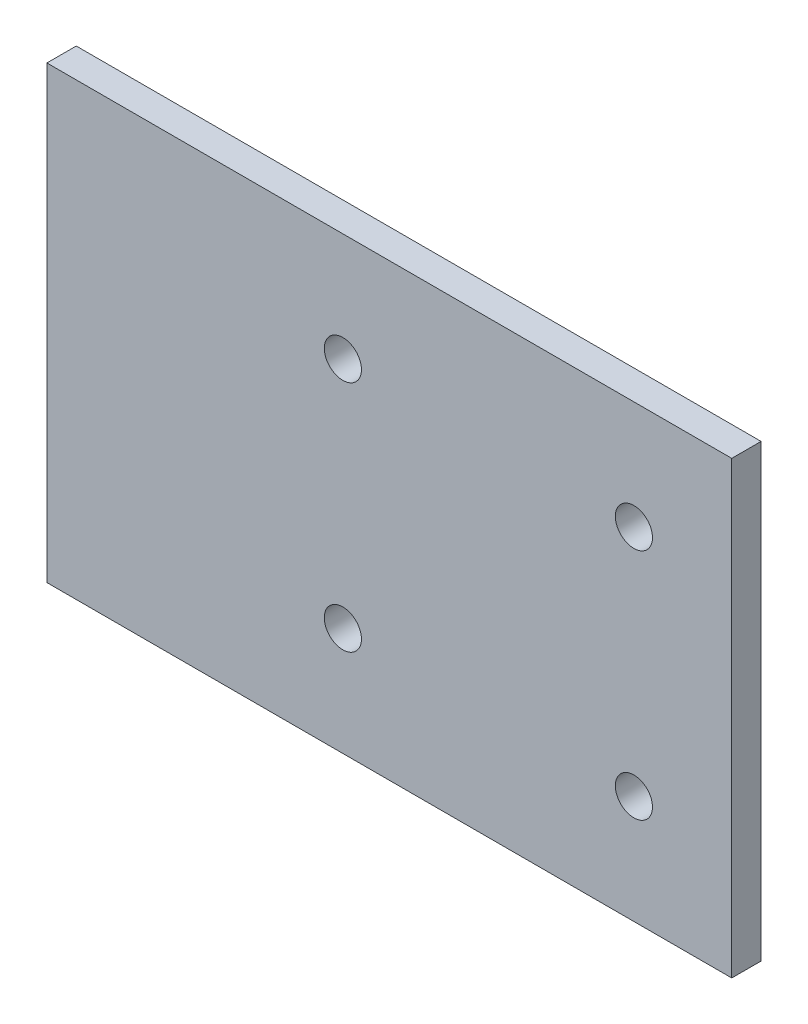
ISO-10303-21;
HEADER;
FILE_DESCRIPTION(('STEP AP214'),'2;1');
FILE_NAME('part.step','',(''),(''),'','','');
FILE_SCHEMA(('AUTOMOTIVE_DESIGN { 1 0 10303 214 1 1 1 1 }'));
ENDSEC;
DATA;
#1=APPLICATION_CONTEXT('core data for automotive mechanical design processes');
#2=APPLICATION_PROTOCOL_DEFINITION('international standard','automotive_design',2000,#1);
#3=PRODUCT_CONTEXT('',#1,'mechanical');
#4=PRODUCT('Part','Part','',(#3));
#5=PRODUCT_RELATED_PRODUCT_CATEGORY('part','',(#4));
#6=PRODUCT_DEFINITION_FORMATION('','',#4);
#7=PRODUCT_DEFINITION_CONTEXT('part definition',#1,'design');
#8=PRODUCT_DEFINITION('design','',#6,#7);
#9=PRODUCT_DEFINITION_SHAPE('','',#8);
#10=(LENGTH_UNIT() NAMED_UNIT(*) SI_UNIT(.MILLI.,.METRE.));
#11=(NAMED_UNIT(*) PLANE_ANGLE_UNIT() SI_UNIT($,.RADIAN.));
#12=(NAMED_UNIT(*) SI_UNIT($,.STERADIAN.) SOLID_ANGLE_UNIT());
#13=UNCERTAINTY_MEASURE_WITH_UNIT(LENGTH_MEASURE(1.E-05),#10,'distance_accuracy_value','');
#14=(GEOMETRIC_REPRESENTATION_CONTEXT(3) GLOBAL_UNCERTAINTY_ASSIGNED_CONTEXT((#13)) GLOBAL_UNIT_ASSIGNED_CONTEXT((#10,
#11,#12)) REPRESENTATION_CONTEXT('',''));
#15=CARTESIAN_POINT('',(0.,0.,0.));
#16=DIRECTION('',(0.,0.,1.));
#17=DIRECTION('',(1.,0.,0.));
#18=AXIS2_PLACEMENT_3D('',#15,#16,#17);
#19=CARTESIAN_POINT('',(-36.0143442622951,24.5901639344262,3.));
#20=DIRECTION('',(1.,0.,0.));
#21=DIRECTION('',(0.,0.,-1.));
#22=AXIS2_PLACEMENT_3D('',#19,#20,#21);
#23=PLANE('',#22);
#24=DIRECTION('',(0.,-1.,0.));
#25=VECTOR('',#24,1.);
#26=CARTESIAN_POINT('',(-36.0143442622951,24.5901639344262,0.));
#27=LINE('',#26,#25);
#28=CARTESIAN_POINT('',(-36.0143442622951,24.5901639344262,0.));
#29=VERTEX_POINT('',#28);
#30=CARTESIAN_POINT('',(-36.0143442622951,-21.4098360655738,0.));
#31=VERTEX_POINT('',#30);
#32=EDGE_CURVE('E98',#29,#31,#27,.T.);
#33=ORIENTED_EDGE('',*,*,#32,.T.);
#34=DIRECTION('',(0.,0.,-1.));
#35=VECTOR('',#34,1.);
#36=CARTESIAN_POINT('',(-36.0143442622951,-21.4098360655738,3.));
#37=LINE('',#36,#35);
#38=CARTESIAN_POINT('',(-36.0143442622951,-21.4098360655738,3.));
#39=VERTEX_POINT('',#38);
#40=EDGE_CURVE('E11',#39,#31,#37,.T.);
#41=ORIENTED_EDGE('',*,*,#40,.F.);
#42=DIRECTION('',(0.,-1.,0.));
#43=VECTOR('',#42,1.);
#44=CARTESIAN_POINT('',(-36.0143442622951,24.5901639344262,3.));
#45=LINE('',#44,#43);
#46=CARTESIAN_POINT('',(-36.0143442622951,24.5901639344262,3.));
#47=VERTEX_POINT('',#46);
#48=EDGE_CURVE('E86',#47,#39,#45,.T.);
#49=ORIENTED_EDGE('',*,*,#48,.F.);
#50=DIRECTION('',(0.,0.,-1.));
#51=VECTOR('',#50,1.);
#52=CARTESIAN_POINT('',(-36.0143442622951,24.5901639344262,3.));
#53=LINE('',#52,#51);
#54=EDGE_CURVE('E94',#47,#29,#53,.T.);
#55=ORIENTED_EDGE('',*,*,#54,.T.);
#56=EDGE_LOOP('',(#33,#41,#49,#55));
#57=FACE_BOUND('',#56,.T.);
#58=ADVANCED_FACE('F35',(#57),#23,.F.);
#59=CARTESIAN_POINT('',(-36.0143442622951,-21.4098360655738,3.));
#60=DIRECTION('',(0.,1.,0.));
#61=DIRECTION('',(0.,0.,1.));
#62=AXIS2_PLACEMENT_3D('',#59,#60,#61);
#63=PLANE('',#62);
#64=DIRECTION('',(1.,0.,0.));
#65=VECTOR('',#64,1.);
#66=CARTESIAN_POINT('',(-36.0143442622951,-21.4098360655738,0.));
#67=LINE('',#66,#65);
#68=CARTESIAN_POINT('',(33.9856557377049,-21.4098360655738,0.));
#69=VERTEX_POINT('',#68);
#70=EDGE_CURVE('E90',#31,#69,#67,.T.);
#71=ORIENTED_EDGE('',*,*,#70,.T.);
#72=DIRECTION('',(0.,0.,-1.));
#73=VECTOR('',#72,1.);
#74=CARTESIAN_POINT('',(33.9856557377049,-21.4098360655738,3.));
#75=LINE('',#74,#73);
#76=CARTESIAN_POINT('',(33.9856557377049,-21.4098360655738,3.));
#77=VERTEX_POINT('',#76);
#78=EDGE_CURVE('E43',#77,#69,#75,.T.);
#79=ORIENTED_EDGE('',*,*,#78,.F.);
#80=DIRECTION('',(1.,0.,0.));
#81=VECTOR('',#80,1.);
#82=CARTESIAN_POINT('',(-36.0143442622951,-21.4098360655738,3.));
#83=LINE('',#82,#81);
#84=EDGE_CURVE('E81',#39,#77,#83,.T.);
#85=ORIENTED_EDGE('',*,*,#84,.F.);
#86=ORIENTED_EDGE('',*,*,#40,.T.);
#87=EDGE_LOOP('',(#71,#79,#85,#86));
#88=FACE_BOUND('',#87,.T.);
#89=ADVANCED_FACE('F89',(#88),#63,.F.);
#90=CARTESIAN_POINT('',(33.9856557377049,24.5901639344262,3.));
#91=DIRECTION('',(-1.,0.,0.));
#92=DIRECTION('',(0.,0.,1.));
#93=AXIS2_PLACEMENT_3D('',#90,#91,#92);
#94=PLANE('',#93);
#95=DIRECTION('',(0.,1.,0.));
#96=VECTOR('',#95,1.);
#97=CARTESIAN_POINT('',(33.9856557377049,24.5901639344262,0.));
#98=LINE('',#97,#96);
#99=CARTESIAN_POINT('',(33.9856557377049,24.5901639344262,0.));
#100=VERTEX_POINT('',#99);
#101=EDGE_CURVE('E68',#69,#100,#98,.T.);
#102=ORIENTED_EDGE('',*,*,#101,.T.);
#103=DIRECTION('',(0.,0.,-1.));
#104=VECTOR('',#103,1.);
#105=CARTESIAN_POINT('',(33.9856557377049,24.5901639344262,3.));
#106=LINE('',#105,#104);
#107=CARTESIAN_POINT('',(33.9856557377049,24.5901639344262,3.));
#108=VERTEX_POINT('',#107);
#109=EDGE_CURVE('E91',#108,#100,#106,.T.);
#110=ORIENTED_EDGE('',*,*,#109,.F.);
#111=DIRECTION('',(0.,1.,0.));
#112=VECTOR('',#111,1.);
#113=CARTESIAN_POINT('',(33.9856557377049,24.5901639344262,3.));
#114=LINE('',#113,#112);
#115=EDGE_CURVE('E84',#77,#108,#114,.T.);
#116=ORIENTED_EDGE('',*,*,#115,.F.);
#117=ORIENTED_EDGE('',*,*,#78,.T.);
#118=EDGE_LOOP('',(#102,#110,#116,#117));
#119=FACE_BOUND('',#118,.T.);
#120=ADVANCED_FACE('F92',(#119),#94,.F.);
#121=CARTESIAN_POINT('',(-36.0143442622951,24.5901639344262,3.));
#122=DIRECTION('',(0.,-1.,0.));
#123=DIRECTION('',(0.,0.,-1.));
#124=AXIS2_PLACEMENT_3D('',#121,#122,#123);
#125=PLANE('',#124);
#126=DIRECTION('',(-1.,0.,0.));
#127=VECTOR('',#126,1.);
#128=CARTESIAN_POINT('',(-36.0143442622951,24.5901639344262,0.));
#129=LINE('',#128,#127);
#130=EDGE_CURVE('E74',#100,#29,#129,.T.);
#131=ORIENTED_EDGE('',*,*,#130,.T.);
#132=ORIENTED_EDGE('',*,*,#54,.F.);
#133=DIRECTION('',(-1.,0.,0.));
#134=VECTOR('',#133,1.);
#135=CARTESIAN_POINT('',(-36.0143442622951,24.5901639344262,3.));
#136=LINE('',#135,#134);
#137=EDGE_CURVE('E51',#108,#47,#136,.T.);
#138=ORIENTED_EDGE('',*,*,#137,.F.);
#139=ORIENTED_EDGE('',*,*,#109,.T.);
#140=EDGE_LOOP('',(#131,#132,#138,#139));
#141=FACE_BOUND('',#140,.T.);
#142=ADVANCED_FACE('F106',(#141),#125,.F.);
#143=CARTESIAN_POINT('',(0.,0.,3.));
#144=DIRECTION('',(0.,0.,1.));
#145=DIRECTION('',(1.,0.,0.));
#146=AXIS2_PLACEMENT_3D('',#143,#144,#145);
#147=PLANE('',#146);
#148=CARTESIAN_POINT('',(23.9856557377049,13.5151639344262,3.));
#149=DIRECTION('',(0.,0.,1.));
#150=DIRECTION('',(1.,0.,0.));
#151=AXIS2_PLACEMENT_3D('',#148,#149,#150);
#152=CIRCLE('',#151,1.89864999999999);
#153=CARTESIAN_POINT('',(25.8843057377049,13.5151639344262,3.));
#154=VERTEX_POINT('',#153);
#155=EDGE_CURVE('E132',#154,#154,#152,.T.);
#156=ORIENTED_EDGE('',*,*,#155,.F.);
#157=EDGE_LOOP('',(#156));
#158=FACE_BOUND('',#157,.T.);
#159=CARTESIAN_POINT('',(23.9856557377049,-10.3348360655738,3.));
#160=DIRECTION('',(0.,0.,1.));
#161=DIRECTION('',(1.,0.,0.));
#162=AXIS2_PLACEMENT_3D('',#159,#160,#161);
#163=CIRCLE('',#162,1.89864999999999);
#164=CARTESIAN_POINT('',(25.8843057377049,-10.3348360655738,3.));
#165=VERTEX_POINT('',#164);
#166=EDGE_CURVE('E126',#165,#165,#163,.T.);
#167=ORIENTED_EDGE('',*,*,#166,.F.);
#168=EDGE_LOOP('',(#167));
#169=FACE_BOUND('',#168,.T.);
#170=CARTESIAN_POINT('',(-5.76434426229508,-10.3348360655738,3.));
#171=DIRECTION('',(0.,0.,1.));
#172=DIRECTION('',(1.,0.,0.));
#173=AXIS2_PLACEMENT_3D('',#170,#171,#172);
#174=CIRCLE('',#173,1.89864999999999);
#175=CARTESIAN_POINT('',(-3.86569426229509,-10.3348360655738,3.));
#176=VERTEX_POINT('',#175);
#177=EDGE_CURVE('E120',#176,#176,#174,.T.);
#178=ORIENTED_EDGE('',*,*,#177,.F.);
#179=EDGE_LOOP('',(#178));
#180=FACE_BOUND('',#179,.T.);
#181=CARTESIAN_POINT('',(-5.76434426229508,13.5151639344262,3.));
#182=DIRECTION('',(0.,0.,1.));
#183=DIRECTION('',(1.,0.,0.));
#184=AXIS2_PLACEMENT_3D('',#181,#182,#183);
#185=CIRCLE('',#184,1.89864999999999);
#186=CARTESIAN_POINT('',(-3.86569426229509,13.5151639344262,3.));
#187=VERTEX_POINT('',#186);
#188=EDGE_CURVE('E114',#187,#187,#185,.T.);
#189=ORIENTED_EDGE('',*,*,#188,.F.);
#190=EDGE_LOOP('',(#189));
#191=FACE_BOUND('',#190,.T.);
#192=ORIENTED_EDGE('',*,*,#48,.T.);
#193=ORIENTED_EDGE('',*,*,#84,.T.);
#194=ORIENTED_EDGE('',*,*,#115,.T.);
#195=ORIENTED_EDGE('',*,*,#137,.T.);
#196=EDGE_LOOP('',(#192,#193,#194,#195));
#197=FACE_BOUND('',#196,.T.);
#198=ADVANCED_FACE('F82',(#158,#169,#180,#191,#197),#147,.T.);
#199=CARTESIAN_POINT('',(0.,0.,0.));
#200=DIRECTION('',(0.,0.,1.));
#201=DIRECTION('',(1.,0.,0.));
#202=AXIS2_PLACEMENT_3D('',#199,#200,#201);
#203=PLANE('',#202);
#204=CARTESIAN_POINT('',(23.9856557377049,13.5151639344262,0.));
#205=DIRECTION('',(0.,0.,1.));
#206=DIRECTION('',(1.,0.,0.));
#207=AXIS2_PLACEMENT_3D('',#204,#205,#206);
#208=CIRCLE('',#207,1.89864999999999);
#209=CARTESIAN_POINT('',(25.8843057377049,13.5151639344262,0.));
#210=VERTEX_POINT('',#209);
#211=EDGE_CURVE('E129',#210,#210,#208,.T.);
#212=ORIENTED_EDGE('',*,*,#211,.T.);
#213=EDGE_LOOP('',(#212));
#214=FACE_BOUND('',#213,.T.);
#215=CARTESIAN_POINT('',(23.9856557377049,-10.3348360655738,0.));
#216=DIRECTION('',(0.,0.,1.));
#217=DIRECTION('',(1.,0.,0.));
#218=AXIS2_PLACEMENT_3D('',#215,#216,#217);
#219=CIRCLE('',#218,1.89864999999999);
#220=CARTESIAN_POINT('',(25.8843057377049,-10.3348360655738,0.));
#221=VERTEX_POINT('',#220);
#222=EDGE_CURVE('E123',#221,#221,#219,.T.);
#223=ORIENTED_EDGE('',*,*,#222,.T.);
#224=EDGE_LOOP('',(#223));
#225=FACE_BOUND('',#224,.T.);
#226=CARTESIAN_POINT('',(-5.76434426229508,-10.3348360655738,0.));
#227=DIRECTION('',(0.,0.,1.));
#228=DIRECTION('',(1.,0.,0.));
#229=AXIS2_PLACEMENT_3D('',#226,#227,#228);
#230=CIRCLE('',#229,1.89864999999999);
#231=CARTESIAN_POINT('',(-3.86569426229509,-10.3348360655738,0.));
#232=VERTEX_POINT('',#231);
#233=EDGE_CURVE('E117',#232,#232,#230,.T.);
#234=ORIENTED_EDGE('',*,*,#233,.T.);
#235=EDGE_LOOP('',(#234));
#236=FACE_BOUND('',#235,.T.);
#237=CARTESIAN_POINT('',(-5.76434426229508,13.5151639344262,0.));
#238=DIRECTION('',(0.,0.,1.));
#239=DIRECTION('',(1.,0.,0.));
#240=AXIS2_PLACEMENT_3D('',#237,#238,#239);
#241=CIRCLE('',#240,1.89864999999999);
#242=CARTESIAN_POINT('',(-3.86569426229509,13.5151639344262,0.));
#243=VERTEX_POINT('',#242);
#244=EDGE_CURVE('E101',#243,#243,#241,.T.);
#245=ORIENTED_EDGE('',*,*,#244,.T.);
#246=EDGE_LOOP('',(#245));
#247=FACE_BOUND('',#246,.T.);
#248=ORIENTED_EDGE('',*,*,#32,.F.);
#249=ORIENTED_EDGE('',*,*,#130,.F.);
#250=ORIENTED_EDGE('',*,*,#101,.F.);
#251=ORIENTED_EDGE('',*,*,#70,.F.);
#252=EDGE_LOOP('',(#248,#249,#250,#251));
#253=FACE_BOUND('',#252,.T.);
#254=ADVANCED_FACE('F109',(#214,#225,#236,#247,#253),#203,.F.);
#255=CARTESIAN_POINT('',(-5.76434426229508,13.5151639344262,3.));
#256=DIRECTION('',(0.,0.,1.));
#257=DIRECTION('',(1.,0.,0.));
#258=AXIS2_PLACEMENT_3D('',#255,#256,#257);
#259=CYLINDRICAL_SURFACE('',#258,1.89864999999999);
#260=ORIENTED_EDGE('',*,*,#244,.F.);
#261=EDGE_LOOP('',(#260));
#262=FACE_BOUND('',#261,.T.);
#263=ORIENTED_EDGE('',*,*,#188,.T.);
#264=EDGE_LOOP('',(#263));
#265=FACE_BOUND('',#264,.T.);
#266=ADVANCED_FACE('F147',(#262,#265),#259,.F.);
#267=CARTESIAN_POINT('',(-5.76434426229508,-10.3348360655738,3.));
#268=DIRECTION('',(0.,0.,1.));
#269=DIRECTION('',(1.,0.,0.));
#270=AXIS2_PLACEMENT_3D('',#267,#268,#269);
#271=CYLINDRICAL_SURFACE('',#270,1.89864999999999);
#272=ORIENTED_EDGE('',*,*,#233,.F.);
#273=EDGE_LOOP('',(#272));
#274=FACE_BOUND('',#273,.T.);
#275=ORIENTED_EDGE('',*,*,#177,.T.);
#276=EDGE_LOOP('',(#275));
#277=FACE_BOUND('',#276,.T.);
#278=ADVANCED_FACE('F149',(#274,#277),#271,.F.);
#279=CARTESIAN_POINT('',(23.9856557377049,-10.3348360655738,3.));
#280=DIRECTION('',(0.,0.,1.));
#281=DIRECTION('',(1.,0.,0.));
#282=AXIS2_PLACEMENT_3D('',#279,#280,#281);
#283=CYLINDRICAL_SURFACE('',#282,1.89864999999999);
#284=ORIENTED_EDGE('',*,*,#222,.F.);
#285=EDGE_LOOP('',(#284));
#286=FACE_BOUND('',#285,.T.);
#287=ORIENTED_EDGE('',*,*,#166,.T.);
#288=EDGE_LOOP('',(#287));
#289=FACE_BOUND('',#288,.T.);
#290=ADVANCED_FACE('F156',(#286,#289),#283,.F.);
#291=CARTESIAN_POINT('',(23.9856557377049,13.5151639344262,3.));
#292=DIRECTION('',(0.,0.,1.));
#293=DIRECTION('',(1.,0.,0.));
#294=AXIS2_PLACEMENT_3D('',#291,#292,#293);
#295=CYLINDRICAL_SURFACE('',#294,1.89864999999999);
#296=ORIENTED_EDGE('',*,*,#211,.F.);
#297=EDGE_LOOP('',(#296));
#298=FACE_BOUND('',#297,.T.);
#299=ORIENTED_EDGE('',*,*,#155,.T.);
#300=EDGE_LOOP('',(#299));
#301=FACE_BOUND('',#300,.T.);
#302=ADVANCED_FACE('F136',(#298,#301),#295,.F.);
#303=CLOSED_SHELL('',(#58,#89,#120,#142,#198,#254,#266,#278,#290,#302));
#304=MANIFOLD_SOLID_BREP('B2',#303);
#305=ADVANCED_BREP_SHAPE_REPRESENTATION('',(#18,#304),#14);
#306=SHAPE_DEFINITION_REPRESENTATION(#9,#305);
ENDSEC;
END-ISO-10303-21;
